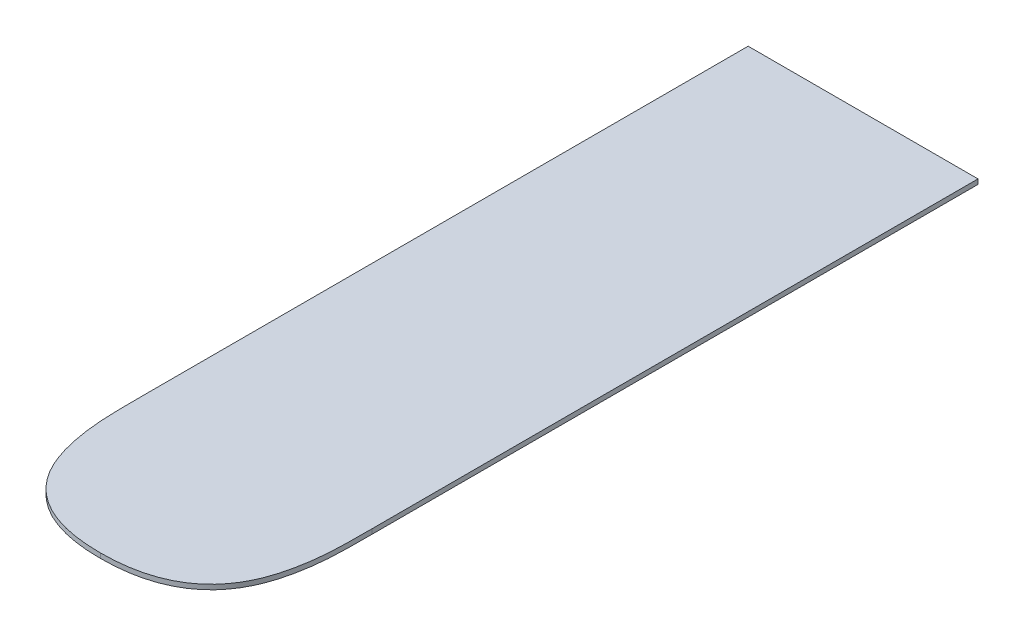
ISO-10303-21;
HEADER;
FILE_DESCRIPTION(('STEP AP214'),'2;1');
FILE_NAME('part.step','',(''),(''),'','','');
FILE_SCHEMA(('AUTOMOTIVE_DESIGN { 1 0 10303 214 1 1 1 1 }'));
ENDSEC;
DATA;
#1=APPLICATION_CONTEXT('core data for automotive mechanical design processes');
#2=APPLICATION_PROTOCOL_DEFINITION('international standard','automotive_design',2000,#1);
#3=PRODUCT_CONTEXT('',#1,'mechanical');
#4=PRODUCT('Part','Part','',(#3));
#5=PRODUCT_RELATED_PRODUCT_CATEGORY('part','',(#4));
#6=PRODUCT_DEFINITION_FORMATION('','',#4);
#7=PRODUCT_DEFINITION_CONTEXT('part definition',#1,'design');
#8=PRODUCT_DEFINITION('design','',#6,#7);
#9=PRODUCT_DEFINITION_SHAPE('','',#8);
#10=(LENGTH_UNIT() NAMED_UNIT(*) SI_UNIT(.MILLI.,.METRE.));
#11=(NAMED_UNIT(*) PLANE_ANGLE_UNIT() SI_UNIT($,.RADIAN.));
#12=(NAMED_UNIT(*) SI_UNIT($,.STERADIAN.) SOLID_ANGLE_UNIT());
#13=UNCERTAINTY_MEASURE_WITH_UNIT(LENGTH_MEASURE(1.E-05),#10,'distance_accuracy_value','');
#14=(GEOMETRIC_REPRESENTATION_CONTEXT(3) GLOBAL_UNCERTAINTY_ASSIGNED_CONTEXT((#13)) GLOBAL_UNIT_ASSIGNED_CONTEXT((#10,
#11,#12)) REPRESENTATION_CONTEXT('',''));
#15=CARTESIAN_POINT('',(0.,0.,0.));
#16=DIRECTION('',(0.,0.,1.));
#17=DIRECTION('',(1.,0.,0.));
#18=AXIS2_PLACEMENT_3D('',#15,#16,#17);
#19=CARTESIAN_POINT('',(139.7,5.842,1270.));
#20=DIRECTION('',(-1.,0.,0.));
#21=DIRECTION('',(0.,0.,1.));
#22=AXIS2_PLACEMENT_3D('',#19,#20,#21);
#23=PLANE('',#22);
#24=DIRECTION('',(0.,-1.,0.));
#25=VECTOR('',#24,1.);
#26=CARTESIAN_POINT('',(139.7,5.842,533.4));
#27=LINE('',#26,#25);
#28=CARTESIAN_POINT('',(139.7,5.842,533.4));
#29=VERTEX_POINT('',#28);
#30=CARTESIAN_POINT('',(139.7,0.,533.4));
#31=VERTEX_POINT('',#30);
#32=EDGE_CURVE('E49',#29,#31,#27,.T.);
#33=ORIENTED_EDGE('',*,*,#32,.F.);
#34=DIRECTION('',(0.,0.,-1.));
#35=VECTOR('',#34,1.);
#36=CARTESIAN_POINT('',(139.7,5.842,1270.));
#37=LINE('',#36,#35);
#38=CARTESIAN_POINT('',(139.7,5.842,1270.));
#39=VERTEX_POINT('',#38);
#40=EDGE_CURVE('E42',#39,#29,#37,.T.);
#41=ORIENTED_EDGE('',*,*,#40,.F.);
#42=DIRECTION('',(0.,-1.,0.));
#43=VECTOR('',#42,1.);
#44=CARTESIAN_POINT('',(139.7,5.842,1270.));
#45=LINE('',#44,#43);
#46=CARTESIAN_POINT('',(139.7,0.,1270.));
#47=VERTEX_POINT('',#46);
#48=EDGE_CURVE('E11',#39,#47,#45,.T.);
#49=ORIENTED_EDGE('',*,*,#48,.T.);
#50=DIRECTION('',(0.,0.,-1.));
#51=VECTOR('',#50,1.);
#52=CARTESIAN_POINT('',(139.7,0.,1270.));
#53=LINE('',#52,#51);
#54=EDGE_CURVE('E78',#47,#31,#53,.T.);
#55=ORIENTED_EDGE('',*,*,#54,.T.);
#56=EDGE_LOOP('',(#33,#41,#49,#55));
#57=FACE_BOUND('',#56,.T.);
#58=ADVANCED_FACE('F33',(#57),#23,.F.);
#59=CARTESIAN_POINT('',(114.697356932435,5.842,-249.113052580453));
#60=DIRECTION('',(0.,-1.,0.));
#61=DIRECTION('',(0.,0.,-1.));
#62=AXIS2_PLACEMENT_3D('',#59,#60,#61);
#63=PLANE('',#62);
#64=DIRECTION('',(1.,0.,0.));
#65=VECTOR('',#64,1.);
#66=CARTESIAN_POINT('',(1.11981703314034E-13,5.842,533.4));
#67=LINE('',#66,#65);
#68=CARTESIAN_POINT('',(-139.7,5.842,533.4));
#69=VERTEX_POINT('',#68);
#70=EDGE_CURVE('E99',#69,#29,#67,.T.);
#71=ORIENTED_EDGE('',*,*,#70,.F.);
#72=DIRECTION('',(0.,0.,-1.));
#73=VECTOR('',#72,1.);
#74=CARTESIAN_POINT('',(-139.7,5.842,1270.));
#75=LINE('',#74,#73);
#76=CARTESIAN_POINT('',(-139.7,5.842,1270.));
#77=VERTEX_POINT('',#76);
#78=EDGE_CURVE('E106',#77,#69,#75,.T.);
#79=ORIENTED_EDGE('',*,*,#78,.F.);
#80=CARTESIAN_POINT('',(0.,5.842,1460.5));
#81=CARTESIAN_POINT('',(-108.68499424093,5.842,1460.5));
#82=CARTESIAN_POINT('',(-137.201191705175,5.842,1361.3852637555));
#83=CARTESIAN_POINT('',(-139.7,5.842,1312.0377849684));
#84=CARTESIAN_POINT('',(-139.7,5.842,1270.));
#85=B_SPLINE_CURVE_WITH_KNOTS('',3,(#80,#81,#82,#83,#84),.UNSPECIFIED.,.F.,.F.,(4,1,4),(0.,
0.140310504948233,0.20061001161353),.UNSPECIFIED.);
#86=CARTESIAN_POINT('',(0.,5.842,1460.5));
#87=VERTEX_POINT('',#86);
#88=EDGE_CURVE('E109',#87,#77,#85,.T.);
#89=ORIENTED_EDGE('',*,*,#88,.F.);
#90=CARTESIAN_POINT('',(0.,5.842,1460.5));
#91=CARTESIAN_POINT('',(108.68499424093,5.842,1460.5));
#92=CARTESIAN_POINT('',(137.201191705175,5.842,1361.3852637555));
#93=CARTESIAN_POINT('',(139.7,5.842,1312.0377849684));
#94=CARTESIAN_POINT('',(139.7,5.842,1270.));
#95=B_SPLINE_CURVE_WITH_KNOTS('',3,(#90,#91,#92,#93,#94),.UNSPECIFIED.,.F.,.F.,(4,1,4),(0.,
0.140310504948233,0.20061001161353),.UNSPECIFIED.);
#96=EDGE_CURVE('E58',#87,#39,#95,.T.);
#97=ORIENTED_EDGE('',*,*,#96,.T.);
#98=ORIENTED_EDGE('',*,*,#40,.T.);
#99=EDGE_LOOP('',(#71,#79,#89,#97,#98));
#100=FACE_BOUND('',#99,.T.);
#101=ADVANCED_FACE('F138',(#100),#63,.F.);
#102=CARTESIAN_POINT('',(114.697356932435,0.,-249.113052580453));
#103=DIRECTION('',(0.,-1.,0.));
#104=DIRECTION('',(0.,0.,-1.));
#105=AXIS2_PLACEMENT_3D('',#102,#103,#104);
#106=PLANE('',#105);
#107=CARTESIAN_POINT('',(0.,0.,1460.5));
#108=CARTESIAN_POINT('',(108.68499424093,0.,1460.5));
#109=CARTESIAN_POINT('',(137.201191705175,0.,1361.3852637555));
#110=CARTESIAN_POINT('',(139.7,0.,1312.0377849684));
#111=CARTESIAN_POINT('',(139.7,0.,1270.));
#112=B_SPLINE_CURVE_WITH_KNOTS('',3,(#107,#108,#109,#110,#111),.UNSPECIFIED.,.F.,.F.,(4,1,4),
(0.,0.140310504948233,0.20061001161353),.UNSPECIFIED.);
#113=CARTESIAN_POINT('',(0.,0.,1460.5));
#114=VERTEX_POINT('',#113);
#115=EDGE_CURVE('E70',#114,#47,#112,.T.);
#116=ORIENTED_EDGE('',*,*,#115,.F.);
#117=CARTESIAN_POINT('',(0.,0.,1460.5));
#118=CARTESIAN_POINT('',(-108.68499424093,0.,1460.5));
#119=CARTESIAN_POINT('',(-137.201191705175,0.,1361.3852637555));
#120=CARTESIAN_POINT('',(-139.7,0.,1312.0377849684));
#121=CARTESIAN_POINT('',(-139.7,0.,1270.));
#122=B_SPLINE_CURVE_WITH_KNOTS('',3,(#117,#118,#119,#120,#121),.UNSPECIFIED.,.F.,.F.,(4,1,4),
(0.,0.140310504948233,0.20061001161353),.UNSPECIFIED.);
#123=CARTESIAN_POINT('',(-139.7,0.,1270.));
#124=VERTEX_POINT('',#123);
#125=EDGE_CURVE('E110',#114,#124,#122,.T.);
#126=ORIENTED_EDGE('',*,*,#125,.T.);
#127=DIRECTION('',(0.,0.,-1.));
#128=VECTOR('',#127,1.);
#129=CARTESIAN_POINT('',(-139.7,0.,1270.));
#130=LINE('',#129,#128);
#131=CARTESIAN_POINT('',(-139.7,0.,533.4));
#132=VERTEX_POINT('',#131);
#133=EDGE_CURVE('E107',#124,#132,#130,.T.);
#134=ORIENTED_EDGE('',*,*,#133,.T.);
#135=DIRECTION('',(1.,0.,0.));
#136=VECTOR('',#135,1.);
#137=CARTESIAN_POINT('',(1.11981703314034E-13,0.,533.4));
#138=LINE('',#137,#136);
#139=EDGE_CURVE('E84',#132,#31,#138,.T.);
#140=ORIENTED_EDGE('',*,*,#139,.T.);
#141=ORIENTED_EDGE('',*,*,#54,.F.);
#142=EDGE_LOOP('',(#116,#126,#134,#140,#141));
#143=FACE_BOUND('',#142,.T.);
#144=ADVANCED_FACE('F82',(#143),#106,.T.);
#145=DIRECTION('',(0.,-1.,0.));
#146=VECTOR('',#145,1.);
#147=SURFACE_OF_LINEAR_EXTRUSION('',#95,#146);
#148=ORIENTED_EDGE('',*,*,#115,.T.);
#149=ORIENTED_EDGE('',*,*,#48,.F.);
#150=ORIENTED_EDGE('',*,*,#96,.F.);
#151=DIRECTION('',(0.,-1.,0.));
#152=VECTOR('',#151,1.);
#153=CARTESIAN_POINT('',(0.,5.842,1460.5));
#154=LINE('',#153,#152);
#155=EDGE_CURVE('E73',#87,#114,#154,.T.);
#156=ORIENTED_EDGE('',*,*,#155,.T.);
#157=EDGE_LOOP('',(#148,#149,#150,#156));
#158=FACE_BOUND('',#157,.T.);
#159=ADVANCED_FACE('F35',(#158),#147,.F.);
#160=CARTESIAN_POINT('',(1.11981703314034E-13,5.842,533.4));
#161=DIRECTION('',(0.,0.,-1.));
#162=DIRECTION('',(-1.,0.,0.));
#163=AXIS2_PLACEMENT_3D('',#160,#161,#162);
#164=PLANE('',#163);
#165=ORIENTED_EDGE('',*,*,#139,.F.);
#166=DIRECTION('',(0.,-1.,0.));
#167=VECTOR('',#166,1.);
#168=CARTESIAN_POINT('',(-139.7,5.842,533.4));
#169=LINE('',#168,#167);
#170=EDGE_CURVE('E114',#69,#132,#169,.T.);
#171=ORIENTED_EDGE('',*,*,#170,.F.);
#172=ORIENTED_EDGE('',*,*,#70,.T.);
#173=ORIENTED_EDGE('',*,*,#32,.T.);
#174=EDGE_LOOP('',(#165,#171,#172,#173));
#175=FACE_BOUND('',#174,.T.);
#176=ADVANCED_FACE('F135',(#175),#164,.T.);
#177=CARTESIAN_POINT('',(-139.7,5.842,1270.));
#178=DIRECTION('',(1.,0.,0.));
#179=DIRECTION('',(0.,0.,1.));
#180=AXIS2_PLACEMENT_3D('',#177,#178,#179);
#181=PLANE('',#180);
#182=ORIENTED_EDGE('',*,*,#170,.T.);
#183=ORIENTED_EDGE('',*,*,#133,.F.);
#184=DIRECTION('',(0.,-1.,0.));
#185=VECTOR('',#184,1.);
#186=CARTESIAN_POINT('',(-139.7,5.842,1270.));
#187=LINE('',#186,#185);
#188=EDGE_CURVE('E103',#77,#124,#187,.T.);
#189=ORIENTED_EDGE('',*,*,#188,.F.);
#190=ORIENTED_EDGE('',*,*,#78,.T.);
#191=EDGE_LOOP('',(#182,#183,#189,#190));
#192=FACE_BOUND('',#191,.T.);
#193=ADVANCED_FACE('F133',(#192),#181,.F.);
#194=DIRECTION('',(0.,-1.,0.));
#195=VECTOR('',#194,1.);
#196=SURFACE_OF_LINEAR_EXTRUSION('',#85,#195);
#197=ORIENTED_EDGE('',*,*,#125,.F.);
#198=ORIENTED_EDGE('',*,*,#155,.F.);
#199=ORIENTED_EDGE('',*,*,#88,.T.);
#200=ORIENTED_EDGE('',*,*,#188,.T.);
#201=EDGE_LOOP('',(#197,#198,#199,#200));
#202=FACE_BOUND('',#201,.T.);
#203=ADVANCED_FACE('F129',(#202),#196,.T.);
#204=CLOSED_SHELL('',(#58,#101,#144,#159,#176,#193,#203));
#205=MANIFOLD_SOLID_BREP('B2',#204);
#206=ADVANCED_BREP_SHAPE_REPRESENTATION('',(#18,#205),#14);
#207=SHAPE_DEFINITION_REPRESENTATION(#9,#206);
ENDSEC;
END-ISO-10303-21;
